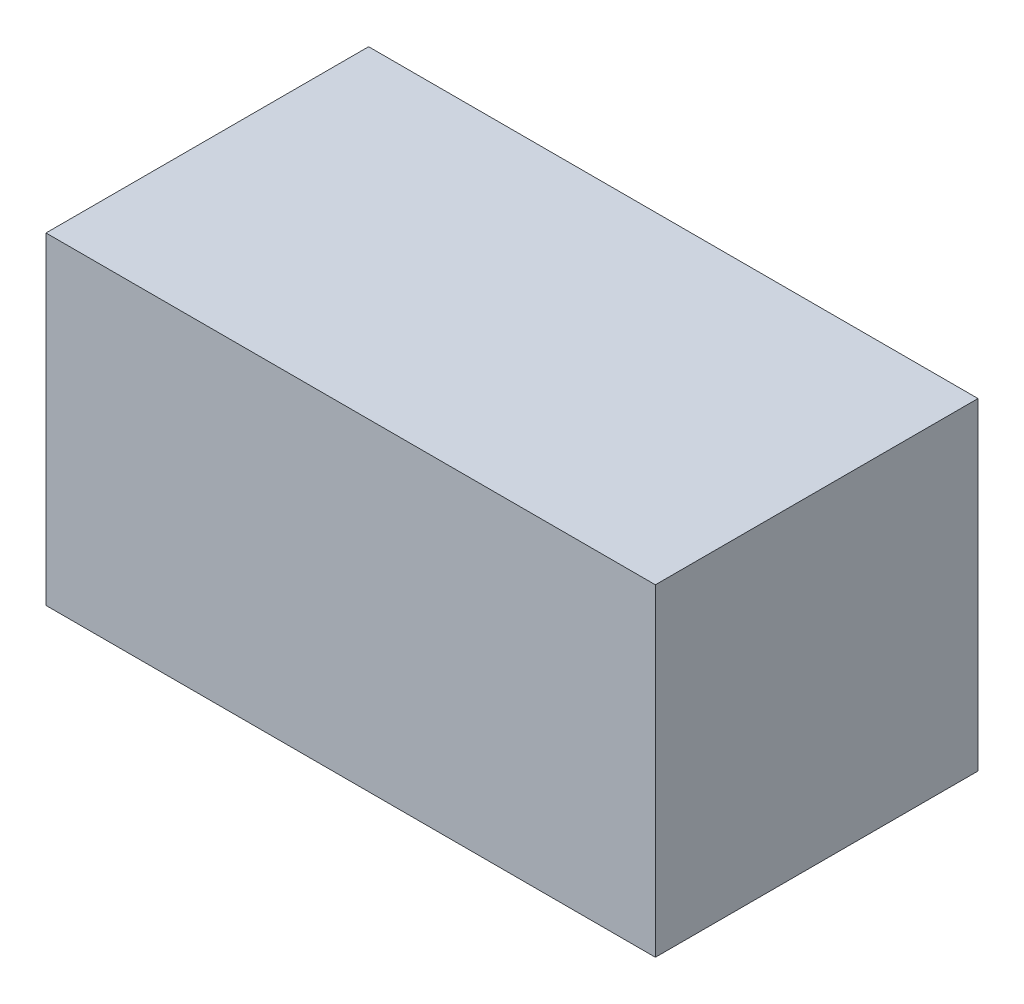
ISO-10303-21;
HEADER;
FILE_DESCRIPTION(('STEP AP214'),'2;1');
FILE_NAME('part.step','',(''),(''),'','','');
FILE_SCHEMA(('AUTOMOTIVE_DESIGN { 1 0 10303 214 1 1 1 1 }'));
ENDSEC;
DATA;
#1=APPLICATION_CONTEXT('core data for automotive mechanical design processes');
#2=APPLICATION_PROTOCOL_DEFINITION('international standard','automotive_design',2000,#1);
#3=PRODUCT_CONTEXT('',#1,'mechanical');
#4=PRODUCT('Part','Part','',(#3));
#5=PRODUCT_RELATED_PRODUCT_CATEGORY('part','',(#4));
#6=PRODUCT_DEFINITION_FORMATION('','',#4);
#7=PRODUCT_DEFINITION_CONTEXT('part definition',#1,'design');
#8=PRODUCT_DEFINITION('design','',#6,#7);
#9=PRODUCT_DEFINITION_SHAPE('','',#8);
#10=(LENGTH_UNIT() NAMED_UNIT(*) SI_UNIT(.MILLI.,.METRE.));
#11=(NAMED_UNIT(*) PLANE_ANGLE_UNIT() SI_UNIT($,.RADIAN.));
#12=(NAMED_UNIT(*) SI_UNIT($,.STERADIAN.) SOLID_ANGLE_UNIT());
#13=UNCERTAINTY_MEASURE_WITH_UNIT(LENGTH_MEASURE(1.E-05),#10,'distance_accuracy_value','');
#14=(GEOMETRIC_REPRESENTATION_CONTEXT(3) GLOBAL_UNCERTAINTY_ASSIGNED_CONTEXT((#13)) GLOBAL_UNIT_ASSIGNED_CONTEXT((#10,
#11,#12)) REPRESENTATION_CONTEXT('',''));
#15=CARTESIAN_POINT('',(0.,0.,0.));
#16=DIRECTION('',(0.,0.,1.));
#17=DIRECTION('',(1.,0.,0.));
#18=AXIS2_PLACEMENT_3D('',#15,#16,#17);
#19=CARTESIAN_POINT('',(-1.69999914,0.90000074,0.));
#20=DIRECTION('',(1.,0.,0.));
#21=DIRECTION('',(0.,-1.,0.));
#22=AXIS2_PLACEMENT_3D('',#19,#20,#21);
#23=PLANE('',#22);
#24=DIRECTION('',(0.,-1.,0.));
#25=VECTOR('',#24,1.);
#26=CARTESIAN_POINT('',(-1.69999914,0.90000074,0.));
#27=LINE('',#26,#25);
#28=CARTESIAN_POINT('',(-1.69999914,0.90000074,0.));
#29=VERTEX_POINT('',#28);
#30=CARTESIAN_POINT('',(-1.69999914,-0.90000074,0.));
#31=VERTEX_POINT('',#30);
#32=EDGE_CURVE('E11',#29,#31,#27,.T.);
#33=ORIENTED_EDGE('',*,*,#32,.T.);
#34=DIRECTION('',(0.,0.,1.));
#35=VECTOR('',#34,1.);
#36=CARTESIAN_POINT('',(-1.69999914,-0.90000074,0.));
#37=LINE('',#36,#35);
#38=CARTESIAN_POINT('',(-1.69999914,-0.90000074,1.79999894));
#39=VERTEX_POINT('',#38);
#40=EDGE_CURVE('E23',#31,#39,#37,.T.);
#41=ORIENTED_EDGE('',*,*,#40,.T.);
#42=DIRECTION('',(0.,-1.,0.));
#43=VECTOR('',#42,1.);
#44=CARTESIAN_POINT('',(-1.69999914,0.90000074,1.79999894));
#45=LINE('',#44,#43);
#46=CARTESIAN_POINT('',(-1.69999914,0.90000074,1.79999894));
#47=VERTEX_POINT('',#46);
#48=EDGE_CURVE('E86',#47,#39,#45,.T.);
#49=ORIENTED_EDGE('',*,*,#48,.F.);
#50=DIRECTION('',(0.,0.,1.));
#51=VECTOR('',#50,1.);
#52=CARTESIAN_POINT('',(-1.69999914,0.90000074,0.));
#53=LINE('',#52,#51);
#54=EDGE_CURVE('E35',#29,#47,#53,.T.);
#55=ORIENTED_EDGE('',*,*,#54,.F.);
#56=EDGE_LOOP('',(#33,#41,#49,#55));
#57=FACE_BOUND('',#56,.T.);
#58=ADVANCED_FACE('F16',(#57),#23,.F.);
#59=CARTESIAN_POINT('',(-1.69999914,-0.90000074,0.));
#60=DIRECTION('',(0.,1.,0.));
#61=DIRECTION('',(1.,0.,0.));
#62=AXIS2_PLACEMENT_3D('',#59,#60,#61);
#63=PLANE('',#62);
#64=DIRECTION('',(1.,0.,0.));
#65=VECTOR('',#64,1.);
#66=CARTESIAN_POINT('',(-1.69999914,-0.90000074,0.));
#67=LINE('',#66,#65);
#68=CARTESIAN_POINT('',(1.70000168,-0.90000074,0.));
#69=VERTEX_POINT('',#68);
#70=EDGE_CURVE('E83',#31,#69,#67,.T.);
#71=ORIENTED_EDGE('',*,*,#70,.T.);
#72=DIRECTION('',(0.,0.,1.));
#73=VECTOR('',#72,1.);
#74=CARTESIAN_POINT('',(1.70000168,-0.90000074,0.));
#75=LINE('',#74,#73);
#76=CARTESIAN_POINT('',(1.70000168,-0.90000074,1.79999894));
#77=VERTEX_POINT('',#76);
#78=EDGE_CURVE('E81',#69,#77,#75,.T.);
#79=ORIENTED_EDGE('',*,*,#78,.T.);
#80=DIRECTION('',(1.,0.,0.));
#81=VECTOR('',#80,1.);
#82=CARTESIAN_POINT('',(-1.69999914,-0.90000074,1.79999894));
#83=LINE('',#82,#81);
#84=EDGE_CURVE('E61',#39,#77,#83,.T.);
#85=ORIENTED_EDGE('',*,*,#84,.F.);
#86=ORIENTED_EDGE('',*,*,#40,.F.);
#87=EDGE_LOOP('',(#71,#79,#85,#86));
#88=FACE_BOUND('',#87,.T.);
#89=ADVANCED_FACE('F88',(#88),#63,.F.);
#90=CARTESIAN_POINT('',(1.70000168,-0.90000074,0.));
#91=DIRECTION('',(-1.,0.,0.));
#92=DIRECTION('',(0.,1.,0.));
#93=AXIS2_PLACEMENT_3D('',#90,#91,#92);
#94=PLANE('',#93);
#95=DIRECTION('',(0.,1.,0.));
#96=VECTOR('',#95,1.);
#97=CARTESIAN_POINT('',(1.70000168,-0.90000074,0.));
#98=LINE('',#97,#96);
#99=CARTESIAN_POINT('',(1.70000168,0.90000074,0.));
#100=VERTEX_POINT('',#99);
#101=EDGE_CURVE('E70',#69,#100,#98,.T.);
#102=ORIENTED_EDGE('',*,*,#101,.T.);
#103=DIRECTION('',(0.,0.,1.));
#104=VECTOR('',#103,1.);
#105=CARTESIAN_POINT('',(1.70000168,0.90000074,0.));
#106=LINE('',#105,#104);
#107=CARTESIAN_POINT('',(1.70000168,0.90000074,1.79999894));
#108=VERTEX_POINT('',#107);
#109=EDGE_CURVE('E64',#100,#108,#106,.T.);
#110=ORIENTED_EDGE('',*,*,#109,.T.);
#111=DIRECTION('',(0.,1.,0.));
#112=VECTOR('',#111,1.);
#113=CARTESIAN_POINT('',(1.70000168,-0.90000074,1.79999894));
#114=LINE('',#113,#112);
#115=EDGE_CURVE('E56',#77,#108,#114,.T.);
#116=ORIENTED_EDGE('',*,*,#115,.F.);
#117=ORIENTED_EDGE('',*,*,#78,.F.);
#118=EDGE_LOOP('',(#102,#110,#116,#117));
#119=FACE_BOUND('',#118,.T.);
#120=ADVANCED_FACE('F68',(#119),#94,.F.);
#121=CARTESIAN_POINT('',(1.70000168,0.90000074,0.));
#122=DIRECTION('',(0.,-1.,0.));
#123=DIRECTION('',(-1.,0.,0.));
#124=AXIS2_PLACEMENT_3D('',#121,#122,#123);
#125=PLANE('',#124);
#126=DIRECTION('',(-1.,0.,0.));
#127=VECTOR('',#126,1.);
#128=CARTESIAN_POINT('',(1.70000168,0.90000074,0.));
#129=LINE('',#128,#127);
#130=EDGE_CURVE('E65',#100,#29,#129,.T.);
#131=ORIENTED_EDGE('',*,*,#130,.T.);
#132=ORIENTED_EDGE('',*,*,#54,.T.);
#133=DIRECTION('',(-1.,0.,0.));
#134=VECTOR('',#133,1.);
#135=CARTESIAN_POINT('',(1.70000168,0.90000074,1.79999894));
#136=LINE('',#135,#134);
#137=EDGE_CURVE('E60',#108,#47,#136,.T.);
#138=ORIENTED_EDGE('',*,*,#137,.F.);
#139=ORIENTED_EDGE('',*,*,#109,.F.);
#140=EDGE_LOOP('',(#131,#132,#138,#139));
#141=FACE_BOUND('',#140,.T.);
#142=ADVANCED_FACE('F75',(#141),#125,.F.);
#143=CARTESIAN_POINT('',(-1.69999914,0.90000074,0.));
#144=DIRECTION('',(0.,0.,-1.));
#145=DIRECTION('',(-1.,0.,0.));
#146=AXIS2_PLACEMENT_3D('',#143,#144,#145);
#147=PLANE('',#146);
#148=ORIENTED_EDGE('',*,*,#130,.F.);
#149=ORIENTED_EDGE('',*,*,#101,.F.);
#150=ORIENTED_EDGE('',*,*,#70,.F.);
#151=ORIENTED_EDGE('',*,*,#32,.F.);
#152=EDGE_LOOP('',(#148,#149,#150,#151));
#153=FACE_BOUND('',#152,.T.);
#154=ADVANCED_FACE('F90',(#153),#147,.T.);
#155=CARTESIAN_POINT('',(-1.69999914,0.90000074,1.79999894));
#156=DIRECTION('',(0.,0.,-1.));
#157=DIRECTION('',(-1.,0.,0.));
#158=AXIS2_PLACEMENT_3D('',#155,#156,#157);
#159=PLANE('',#158);
#160=ORIENTED_EDGE('',*,*,#48,.T.);
#161=ORIENTED_EDGE('',*,*,#84,.T.);
#162=ORIENTED_EDGE('',*,*,#115,.T.);
#163=ORIENTED_EDGE('',*,*,#137,.T.);
#164=EDGE_LOOP('',(#160,#161,#162,#163));
#165=FACE_BOUND('',#164,.T.);
#166=ADVANCED_FACE('F58',(#165),#159,.F.);
#167=CLOSED_SHELL('',(#58,#89,#120,#142,#154,#166));
#168=MANIFOLD_SOLID_BREP('B1',#167);
#169=ADVANCED_BREP_SHAPE_REPRESENTATION('',(#18,#168),#14);
#170=SHAPE_DEFINITION_REPRESENTATION(#9,#169);
ENDSEC;
END-ISO-10303-21;
